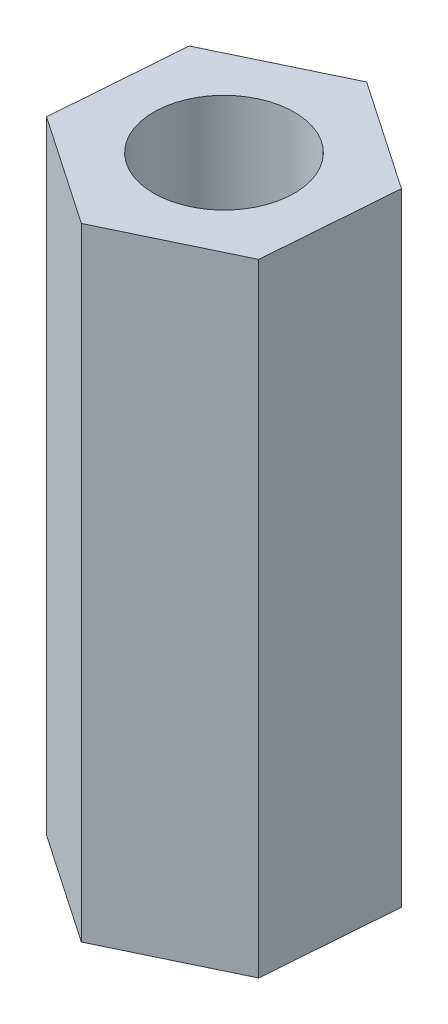
ISO-10303-21;
HEADER;
FILE_DESCRIPTION(('STEP AP214'),'2;1');
FILE_NAME('part.step','',(''),(''),'','','');
FILE_SCHEMA(('AUTOMOTIVE_DESIGN { 1 0 10303 214 1 1 1 1 }'));
ENDSEC;
DATA;
#1=APPLICATION_CONTEXT('core data for automotive mechanical design processes');
#2=APPLICATION_PROTOCOL_DEFINITION('international standard','automotive_design',2000,#1);
#3=PRODUCT_CONTEXT('',#1,'mechanical');
#4=PRODUCT('Part','Part','',(#3));
#5=PRODUCT_RELATED_PRODUCT_CATEGORY('part','',(#4));
#6=PRODUCT_DEFINITION_FORMATION('','',#4);
#7=PRODUCT_DEFINITION_CONTEXT('part definition',#1,'design');
#8=PRODUCT_DEFINITION('design','',#6,#7);
#9=PRODUCT_DEFINITION_SHAPE('','',#8);
#10=(LENGTH_UNIT() NAMED_UNIT(*) SI_UNIT(.MILLI.,.METRE.));
#11=(NAMED_UNIT(*) PLANE_ANGLE_UNIT() SI_UNIT($,.RADIAN.));
#12=(NAMED_UNIT(*) SI_UNIT($,.STERADIAN.) SOLID_ANGLE_UNIT());
#13=UNCERTAINTY_MEASURE_WITH_UNIT(LENGTH_MEASURE(1.E-05),#10,'distance_accuracy_value','');
#14=(GEOMETRIC_REPRESENTATION_CONTEXT(3) GLOBAL_UNCERTAINTY_ASSIGNED_CONTEXT((#13)) GLOBAL_UNIT_ASSIGNED_CONTEXT((#10,
#11,#12)) REPRESENTATION_CONTEXT('',''));
#15=CARTESIAN_POINT('',(0.,0.,0.));
#16=DIRECTION('',(0.,0.,1.));
#17=DIRECTION('',(1.,0.,0.));
#18=AXIS2_PLACEMENT_3D('',#15,#16,#17);
#19=CARTESIAN_POINT('',(2.24024721059126,12.7,1.53121708740838));
#20=DIRECTION('',(-0.997115683466248,0.,-0.0758967310602797));
#21=DIRECTION('',(-0.0758967310602797,0.,0.997115683466248));
#22=AXIS2_PLACEMENT_3D('',#19,#20,#21);
#23=PLANE('',#22);
#24=DIRECTION('',(0.0758967310602797,0.,-0.997115683466248));
#25=VECTOR('',#24,1.);
#26=CARTESIAN_POINT('',(2.24024721059126,0.,1.53121708740838));
#27=LINE('',#26,#25);
#28=CARTESIAN_POINT('',(2.24024721059126,0.,1.53121708740838));
#29=VERTEX_POINT('',#28);
#30=CARTESIAN_POINT('',(2.44619650170011,0.,-1.17450245142507));
#31=VERTEX_POINT('',#30);
#32=EDGE_CURVE('E117',#29,#31,#27,.T.);
#33=ORIENTED_EDGE('',*,*,#32,.T.);
#34=DIRECTION('',(0.,-1.,0.));
#35=VECTOR('',#34,1.);
#36=CARTESIAN_POINT('',(2.44619650170011,12.7,-1.17450245142507));
#37=LINE('',#36,#35);
#38=CARTESIAN_POINT('',(2.44619650170011,12.7,-1.17450245142507));
#39=VERTEX_POINT('',#38);
#40=EDGE_CURVE('E11',#39,#31,#37,.T.);
#41=ORIENTED_EDGE('',*,*,#40,.F.);
#42=DIRECTION('',(0.0758967310602797,0.,-0.997115683466248));
#43=VECTOR('',#42,1.);
#44=CARTESIAN_POINT('',(2.24024721059126,12.7,1.53121708740838));
#45=LINE('',#44,#43);
#46=CARTESIAN_POINT('',(2.24024721059126,12.7,1.53121708740838));
#47=VERTEX_POINT('',#46);
#48=EDGE_CURVE('E128',#47,#39,#45,.T.);
#49=ORIENTED_EDGE('',*,*,#48,.F.);
#50=DIRECTION('',(0.,-1.,0.));
#51=VECTOR('',#50,1.);
#52=CARTESIAN_POINT('',(2.24024721059126,12.7,1.53121708740838));
#53=LINE('',#52,#51);
#54=EDGE_CURVE('E113',#47,#29,#53,.T.);
#55=ORIENTED_EDGE('',*,*,#54,.T.);
#56=EDGE_LOOP('',(#33,#41,#49,#55));
#57=FACE_BOUND('',#56,.T.);
#58=ADVANCED_FACE('F33',(#57),#23,.F.);
#59=CARTESIAN_POINT('',(2.44619650170011,12.7,-1.17450245142507));
#60=DIRECTION('',(-0.564286338895522,0.,0.825579146863514));
#61=DIRECTION('',(0.825579146863514,0.,0.564286338895522));
#62=AXIS2_PLACEMENT_3D('',#59,#60,#61);
#63=PLANE('',#62);
#64=DIRECTION('',(-0.825579146863514,0.,-0.564286338895522));
#65=VECTOR('',#64,1.);
#66=CARTESIAN_POINT('',(2.44619650170011,0.,-1.17450245142507));
#67=LINE('',#66,#65);
#68=CARTESIAN_POINT('',(0.205949291108847,0.,-2.70571953883345));
#69=VERTEX_POINT('',#68);
#70=EDGE_CURVE('E120',#31,#69,#67,.T.);
#71=ORIENTED_EDGE('',*,*,#70,.T.);
#72=DIRECTION('',(0.,-1.,0.));
#73=VECTOR('',#72,1.);
#74=CARTESIAN_POINT('',(0.205949291108847,12.7,-2.70571953883345));
#75=LINE('',#74,#73);
#76=CARTESIAN_POINT('',(0.205949291108847,12.7,-2.70571953883345));
#77=VERTEX_POINT('',#76);
#78=EDGE_CURVE('E41',#77,#69,#75,.T.);
#79=ORIENTED_EDGE('',*,*,#78,.F.);
#80=DIRECTION('',(-0.825579146863514,0.,-0.564286338895522));
#81=VECTOR('',#80,1.);
#82=CARTESIAN_POINT('',(2.44619650170011,12.7,-1.17450245142507));
#83=LINE('',#82,#81);
#84=EDGE_CURVE('E86',#39,#77,#83,.T.);
#85=ORIENTED_EDGE('',*,*,#84,.F.);
#86=ORIENTED_EDGE('',*,*,#40,.T.);
#87=EDGE_LOOP('',(#71,#79,#85,#86));
#88=FACE_BOUND('',#87,.T.);
#89=ADVANCED_FACE('F153',(#88),#63,.F.);
#90=CARTESIAN_POINT('',(0.205949291108847,12.7,-2.70571953883345));
#91=DIRECTION('',(0.432829344570726,0.,0.901475877923794));
#92=DIRECTION('',(0.901475877923794,0.,-0.432829344570726));
#93=AXIS2_PLACEMENT_3D('',#90,#91,#92);
#94=PLANE('',#93);
#95=DIRECTION('',(-0.901475877923794,0.,0.432829344570726));
#96=VECTOR('',#95,1.);
#97=CARTESIAN_POINT('',(0.205949291108847,0.,-2.70571953883345));
#98=LINE('',#97,#96);
#99=CARTESIAN_POINT('',(-2.24024721059126,0.,-1.53121708740838));
#100=VERTEX_POINT('',#99);
#101=EDGE_CURVE('E123',#69,#100,#98,.T.);
#102=ORIENTED_EDGE('',*,*,#101,.T.);
#103=DIRECTION('',(0.,-1.,0.));
#104=VECTOR('',#103,1.);
#105=CARTESIAN_POINT('',(-2.24024721059126,12.7,-1.53121708740838));
#106=LINE('',#105,#104);
#107=CARTESIAN_POINT('',(-2.24024721059126,12.7,-1.53121708740838));
#108=VERTEX_POINT('',#107);
#109=EDGE_CURVE('E108',#108,#100,#106,.T.);
#110=ORIENTED_EDGE('',*,*,#109,.F.);
#111=DIRECTION('',(-0.901475877923794,0.,0.432829344570726));
#112=VECTOR('',#111,1.);
#113=CARTESIAN_POINT('',(0.205949291108847,12.7,-2.70571953883345));
#114=LINE('',#113,#112);
#115=EDGE_CURVE('E99',#77,#108,#114,.T.);
#116=ORIENTED_EDGE('',*,*,#115,.F.);
#117=ORIENTED_EDGE('',*,*,#78,.T.);
#118=EDGE_LOOP('',(#102,#110,#116,#117));
#119=FACE_BOUND('',#118,.T.);
#120=ADVANCED_FACE('F134',(#119),#94,.F.);
#121=CARTESIAN_POINT('',(-2.24024721059126,12.7,-1.53121708740838));
#122=DIRECTION('',(0.997115683466248,0.,0.0758967310602797));
#123=DIRECTION('',(0.0758967310602798,0.,-0.997115683466248));
#124=AXIS2_PLACEMENT_3D('',#121,#122,#123);
#125=PLANE('',#124);
#126=DIRECTION('',(-0.0758967310602797,0.,0.997115683466248));
#127=VECTOR('',#126,1.);
#128=CARTESIAN_POINT('',(-2.24024721059126,0.,-1.53121708740838));
#129=LINE('',#128,#127);
#130=CARTESIAN_POINT('',(-2.44619650170011,0.,1.17450245142507));
#131=VERTEX_POINT('',#130);
#132=EDGE_CURVE('E107',#100,#131,#129,.T.);
#133=ORIENTED_EDGE('',*,*,#132,.T.);
#134=DIRECTION('',(0.,-1.,0.));
#135=VECTOR('',#134,1.);
#136=CARTESIAN_POINT('',(-2.44619650170011,12.7,1.17450245142507));
#137=LINE('',#136,#135);
#138=CARTESIAN_POINT('',(-2.44619650170011,12.7,1.17450245142507));
#139=VERTEX_POINT('',#138);
#140=EDGE_CURVE('E104',#139,#131,#137,.T.);
#141=ORIENTED_EDGE('',*,*,#140,.F.);
#142=DIRECTION('',(-0.0758967310602797,0.,0.997115683466248));
#143=VECTOR('',#142,1.);
#144=CARTESIAN_POINT('',(-2.24024721059126,12.7,-1.53121708740838));
#145=LINE('',#144,#143);
#146=EDGE_CURVE('E93',#108,#139,#145,.T.);
#147=ORIENTED_EDGE('',*,*,#146,.F.);
#148=ORIENTED_EDGE('',*,*,#109,.T.);
#149=EDGE_LOOP('',(#133,#141,#147,#148));
#150=FACE_BOUND('',#149,.T.);
#151=ADVANCED_FACE('F105',(#150),#125,.F.);
#152=CARTESIAN_POINT('',(-2.44619650170011,12.7,1.17450245142507));
#153=DIRECTION('',(0.564286338895522,0.,-0.825579146863514));
#154=DIRECTION('',(-0.825579146863514,0.,-0.564286338895522));
#155=AXIS2_PLACEMENT_3D('',#152,#153,#154);
#156=PLANE('',#155);
#157=DIRECTION('',(0.825579146863514,0.,0.564286338895522));
#158=VECTOR('',#157,1.);
#159=CARTESIAN_POINT('',(-2.44619650170011,0.,1.17450245142507));
#160=LINE('',#159,#158);
#161=CARTESIAN_POINT('',(-0.205949291108845,0.,2.70571953883345));
#162=VERTEX_POINT('',#161);
#163=EDGE_CURVE('E72',#131,#162,#160,.T.);
#164=ORIENTED_EDGE('',*,*,#163,.T.);
#165=DIRECTION('',(0.,-1.,0.));
#166=VECTOR('',#165,1.);
#167=CARTESIAN_POINT('',(-0.205949291108845,12.7,2.70571953883345));
#168=LINE('',#167,#166);
#169=CARTESIAN_POINT('',(-0.205949291108845,12.7,2.70571953883345));
#170=VERTEX_POINT('',#169);
#171=EDGE_CURVE('E109',#170,#162,#168,.T.);
#172=ORIENTED_EDGE('',*,*,#171,.F.);
#173=DIRECTION('',(0.825579146863514,0.,0.564286338895522));
#174=VECTOR('',#173,1.);
#175=CARTESIAN_POINT('',(-2.44619650170011,12.7,1.17450245142507));
#176=LINE('',#175,#174);
#177=EDGE_CURVE('E97',#139,#170,#176,.T.);
#178=ORIENTED_EDGE('',*,*,#177,.F.);
#179=ORIENTED_EDGE('',*,*,#140,.T.);
#180=EDGE_LOOP('',(#164,#172,#178,#179));
#181=FACE_BOUND('',#180,.T.);
#182=ADVANCED_FACE('F111',(#181),#156,.F.);
#183=CARTESIAN_POINT('',(-0.205949291108845,12.7,2.70571953883345));
#184=DIRECTION('',(-0.432829344570726,0.,-0.901475877923794));
#185=DIRECTION('',(-0.901475877923794,0.,0.432829344570726));
#186=AXIS2_PLACEMENT_3D('',#183,#184,#185);
#187=PLANE('',#186);
#188=DIRECTION('',(0.901475877923794,0.,-0.432829344570726));
#189=VECTOR('',#188,1.);
#190=CARTESIAN_POINT('',(-0.205949291108845,0.,2.70571953883345));
#191=LINE('',#190,#189);
#192=EDGE_CURVE('E78',#162,#29,#191,.T.);
#193=ORIENTED_EDGE('',*,*,#192,.T.);
#194=ORIENTED_EDGE('',*,*,#54,.F.);
#195=DIRECTION('',(0.901475877923794,0.,-0.432829344570726));
#196=VECTOR('',#195,1.);
#197=CARTESIAN_POINT('',(-0.205949291108845,12.7,2.70571953883345));
#198=LINE('',#197,#196);
#199=EDGE_CURVE('E49',#170,#47,#198,.T.);
#200=ORIENTED_EDGE('',*,*,#199,.F.);
#201=ORIENTED_EDGE('',*,*,#171,.T.);
#202=EDGE_LOOP('',(#193,#194,#200,#201));
#203=FACE_BOUND('',#202,.T.);
#204=ADVANCED_FACE('F141',(#203),#187,.F.);
#205=CARTESIAN_POINT('',(0.,12.7,0.));
#206=DIRECTION('',(0.,1.,0.));
#207=DIRECTION('',(0.,0.,1.));
#208=AXIS2_PLACEMENT_3D('',#205,#206,#207);
#209=PLANE('',#208);
#210=CARTESIAN_POINT('',(0.,12.7,0.));
#211=DIRECTION('',(0.,1.,0.));
#212=DIRECTION('',(0.,0.,1.));
#213=AXIS2_PLACEMENT_3D('',#210,#211,#212);
#214=CIRCLE('',#213,1.435);
#215=CARTESIAN_POINT('',(0.,12.7,1.435));
#216=VERTEX_POINT('',#215);
#217=EDGE_CURVE('E208',#216,#216,#214,.T.);
#218=ORIENTED_EDGE('',*,*,#217,.F.);
#219=EDGE_LOOP('',(#218));
#220=FACE_BOUND('',#219,.T.);
#221=ORIENTED_EDGE('',*,*,#48,.T.);
#222=ORIENTED_EDGE('',*,*,#84,.T.);
#223=ORIENTED_EDGE('',*,*,#115,.T.);
#224=ORIENTED_EDGE('',*,*,#146,.T.);
#225=ORIENTED_EDGE('',*,*,#177,.T.);
#226=ORIENTED_EDGE('',*,*,#199,.T.);
#227=EDGE_LOOP('',(#221,#222,#223,#224,#225,#226));
#228=FACE_BOUND('',#227,.T.);
#229=ADVANCED_FACE('F95',(#220,#228),#209,.T.);
#230=CARTESIAN_POINT('',(0.,0.,0.));
#231=DIRECTION('',(0.,1.,0.));
#232=DIRECTION('',(0.,0.,1.));
#233=AXIS2_PLACEMENT_3D('',#230,#231,#232);
#234=PLANE('',#233);
#235=CARTESIAN_POINT('',(0.,0.,0.));
#236=DIRECTION('',(0.,1.,0.));
#237=DIRECTION('',(0.,0.,1.));
#238=AXIS2_PLACEMENT_3D('',#235,#236,#237);
#239=CIRCLE('',#238,1.435);
#240=CARTESIAN_POINT('',(0.,0.,1.435));
#241=VERTEX_POINT('',#240);
#242=EDGE_CURVE('E121',#241,#241,#239,.T.);
#243=ORIENTED_EDGE('',*,*,#242,.T.);
#244=EDGE_LOOP('',(#243));
#245=FACE_BOUND('',#244,.T.);
#246=ORIENTED_EDGE('',*,*,#32,.F.);
#247=ORIENTED_EDGE('',*,*,#192,.F.);
#248=ORIENTED_EDGE('',*,*,#163,.F.);
#249=ORIENTED_EDGE('',*,*,#132,.F.);
#250=ORIENTED_EDGE('',*,*,#101,.F.);
#251=ORIENTED_EDGE('',*,*,#70,.F.);
#252=EDGE_LOOP('',(#246,#247,#248,#249,#250,#251));
#253=FACE_BOUND('',#252,.T.);
#254=ADVANCED_FACE('F137',(#245,#253),#234,.F.);
#255=CARTESIAN_POINT('',(0.,0.,0.));
#256=DIRECTION('',(0.,1.,0.));
#257=DIRECTION('',(0.,0.,1.));
#258=AXIS2_PLACEMENT_3D('',#255,#256,#257);
#259=CYLINDRICAL_SURFACE('',#258,1.435);
#260=ORIENTED_EDGE('',*,*,#242,.F.);
#261=EDGE_LOOP('',(#260));
#262=FACE_BOUND('',#261,.T.);
#263=ORIENTED_EDGE('',*,*,#217,.T.);
#264=EDGE_LOOP('',(#263));
#265=FACE_BOUND('',#264,.T.);
#266=ADVANCED_FACE('F190',(#262,#265),#259,.F.);
#267=CLOSED_SHELL('',(#58,#89,#120,#151,#182,#204,#229,#254,#266));
#268=MANIFOLD_SOLID_BREP('B2',#267);
#269=ADVANCED_BREP_SHAPE_REPRESENTATION('',(#18,#268),#14);
#270=SHAPE_DEFINITION_REPRESENTATION(#9,#269);
ENDSEC;
END-ISO-10303-21;
